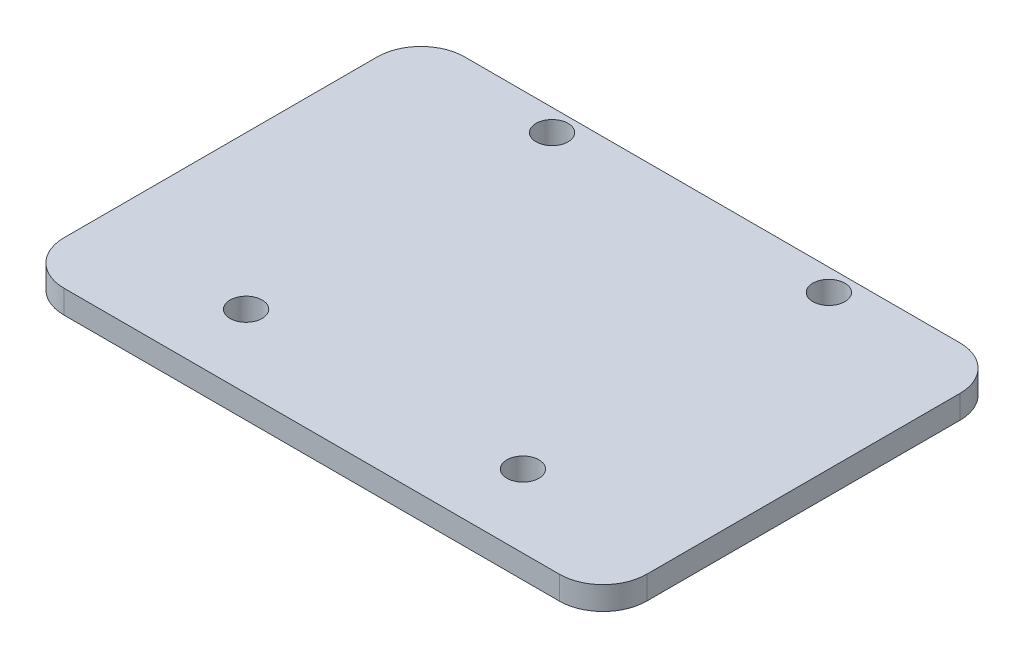
ISO-10303-21;
HEADER;
FILE_DESCRIPTION(('STEP AP214'),'2;1');
FILE_NAME('part.step','',(''),(''),'','','');
FILE_SCHEMA(('AUTOMOTIVE_DESIGN { 1 0 10303 214 1 1 1 1 }'));
ENDSEC;
DATA;
#1=APPLICATION_CONTEXT('core data for automotive mechanical design processes');
#2=APPLICATION_PROTOCOL_DEFINITION('international standard','automotive_design',2000,#1);
#3=PRODUCT_CONTEXT('',#1,'mechanical');
#4=PRODUCT('Part','Part','',(#3));
#5=PRODUCT_RELATED_PRODUCT_CATEGORY('part','',(#4));
#6=PRODUCT_DEFINITION_FORMATION('','',#4);
#7=PRODUCT_DEFINITION_CONTEXT('part definition',#1,'design');
#8=PRODUCT_DEFINITION('design','',#6,#7);
#9=PRODUCT_DEFINITION_SHAPE('','',#8);
#10=(LENGTH_UNIT() NAMED_UNIT(*) SI_UNIT(.MILLI.,.METRE.));
#11=(NAMED_UNIT(*) PLANE_ANGLE_UNIT() SI_UNIT($,.RADIAN.));
#12=(NAMED_UNIT(*) SI_UNIT($,.STERADIAN.) SOLID_ANGLE_UNIT());
#13=UNCERTAINTY_MEASURE_WITH_UNIT(LENGTH_MEASURE(1.E-05),#10,'distance_accuracy_value','');
#14=(GEOMETRIC_REPRESENTATION_CONTEXT(3) GLOBAL_UNCERTAINTY_ASSIGNED_CONTEXT((#13)) GLOBAL_UNIT_ASSIGNED_CONTEXT((#10,
#11,#12)) REPRESENTATION_CONTEXT('',''));
#15=CARTESIAN_POINT('',(0.,0.,0.));
#16=DIRECTION('',(0.,0.,1.));
#17=DIRECTION('',(1.,0.,0.));
#18=AXIS2_PLACEMENT_3D('',#15,#16,#17);
#19=CARTESIAN_POINT('',(-20.,1.6,-13.75));
#20=DIRECTION('',(1.,0.,0.));
#21=DIRECTION('',(0.,0.,-1.));
#22=AXIS2_PLACEMENT_3D('',#19,#20,#21);
#23=PLANE('',#22);
#24=DIRECTION('',(0.,0.,1.));
#25=VECTOR('',#24,1.);
#26=CARTESIAN_POINT('',(-20.,0.,-13.75));
#27=LINE('',#26,#25);
#28=CARTESIAN_POINT('',(-20.,0.,-10.75));
#29=VERTEX_POINT('',#28);
#30=CARTESIAN_POINT('',(-20.,0.,10.75));
#31=VERTEX_POINT('',#30);
#32=EDGE_CURVE('E166',#29,#31,#27,.T.);
#33=ORIENTED_EDGE('',*,*,#32,.T.);
#34=DIRECTION('',(0.,-1.,0.));
#35=VECTOR('',#34,1.);
#36=CARTESIAN_POINT('',(-20.,1.6,10.75));
#37=LINE('',#36,#35);
#38=CARTESIAN_POINT('',(-20.,1.6,10.75));
#39=VERTEX_POINT('',#38);
#40=EDGE_CURVE('E11',#31,#39,#37,.F.);
#41=ORIENTED_EDGE('',*,*,#40,.T.);
#42=DIRECTION('',(0.,0.,1.));
#43=VECTOR('',#42,1.);
#44=CARTESIAN_POINT('',(-20.,1.6,-13.75));
#45=LINE('',#44,#43);
#46=CARTESIAN_POINT('',(-20.,1.6,-10.75));
#47=VERTEX_POINT('',#46);
#48=EDGE_CURVE('E125',#47,#39,#45,.T.);
#49=ORIENTED_EDGE('',*,*,#48,.F.);
#50=DIRECTION('',(0.,-1.,0.));
#51=VECTOR('',#50,1.);
#52=CARTESIAN_POINT('',(-20.,1.6,-10.75));
#53=LINE('',#52,#51);
#54=EDGE_CURVE('E41',#47,#29,#53,.T.);
#55=ORIENTED_EDGE('',*,*,#54,.T.);
#56=EDGE_LOOP('',(#33,#41,#49,#55));
#57=FACE_BOUND('',#56,.T.);
#58=ADVANCED_FACE('F33',(#57),#23,.F.);
#59=CARTESIAN_POINT('',(-20.,1.6,13.75));
#60=DIRECTION('',(0.,0.,-1.));
#61=DIRECTION('',(-1.,0.,0.));
#62=AXIS2_PLACEMENT_3D('',#59,#60,#61);
#63=PLANE('',#62);
#64=DIRECTION('',(1.,0.,0.));
#65=VECTOR('',#64,1.);
#66=CARTESIAN_POINT('',(-20.,0.,13.75));
#67=LINE('',#66,#65);
#68=CARTESIAN_POINT('',(-17.,0.,13.75));
#69=VERTEX_POINT('',#68);
#70=CARTESIAN_POINT('',(17.,0.,13.75));
#71=VERTEX_POINT('',#70);
#72=EDGE_CURVE('E130',#69,#71,#67,.T.);
#73=ORIENTED_EDGE('',*,*,#72,.T.);
#74=DIRECTION('',(0.,-1.,0.));
#75=VECTOR('',#74,1.);
#76=CARTESIAN_POINT('',(17.,1.6,13.75));
#77=LINE('',#76,#75);
#78=CARTESIAN_POINT('',(17.,1.6,13.75));
#79=VERTEX_POINT('',#78);
#80=EDGE_CURVE('E48',#71,#79,#77,.F.);
#81=ORIENTED_EDGE('',*,*,#80,.T.);
#82=DIRECTION('',(1.,0.,0.));
#83=VECTOR('',#82,1.);
#84=CARTESIAN_POINT('',(-20.,1.6,13.75));
#85=LINE('',#84,#83);
#86=CARTESIAN_POINT('',(-17.,1.6,13.75));
#87=VERTEX_POINT('',#86);
#88=EDGE_CURVE('E128',#87,#79,#85,.T.);
#89=ORIENTED_EDGE('',*,*,#88,.F.);
#90=DIRECTION('',(0.,-1.,0.));
#91=VECTOR('',#90,1.);
#92=CARTESIAN_POINT('',(-17.,1.6,13.75));
#93=LINE('',#92,#91);
#94=EDGE_CURVE('E158',#87,#69,#93,.T.);
#95=ORIENTED_EDGE('',*,*,#94,.T.);
#96=EDGE_LOOP('',(#73,#81,#89,#95));
#97=FACE_BOUND('',#96,.T.);
#98=ADVANCED_FACE('F213',(#97),#63,.F.);
#99=CARTESIAN_POINT('',(20.,1.6,-13.75));
#100=DIRECTION('',(-1.,0.,0.));
#101=DIRECTION('',(0.,0.,1.));
#102=AXIS2_PLACEMENT_3D('',#99,#100,#101);
#103=PLANE('',#102);
#104=DIRECTION('',(0.,0.,-1.));
#105=VECTOR('',#104,1.);
#106=CARTESIAN_POINT('',(20.,0.,-13.75));
#107=LINE('',#106,#105);
#108=CARTESIAN_POINT('',(20.,0.,10.75));
#109=VERTEX_POINT('',#108);
#110=CARTESIAN_POINT('',(20.,0.,-10.75));
#111=VERTEX_POINT('',#110);
#112=EDGE_CURVE('E126',#109,#111,#107,.T.);
#113=ORIENTED_EDGE('',*,*,#112,.T.);
#114=DIRECTION('',(0.,-1.,0.));
#115=VECTOR('',#114,1.);
#116=CARTESIAN_POINT('',(20.,1.6,-10.75));
#117=LINE('',#116,#115);
#118=CARTESIAN_POINT('',(20.,1.6,-10.75));
#119=VERTEX_POINT('',#118);
#120=EDGE_CURVE('E104',#111,#119,#117,.F.);
#121=ORIENTED_EDGE('',*,*,#120,.T.);
#122=DIRECTION('',(0.,0.,-1.));
#123=VECTOR('',#122,1.);
#124=CARTESIAN_POINT('',(20.,1.6,-13.75));
#125=LINE('',#124,#123);
#126=CARTESIAN_POINT('',(20.,1.6,10.75));
#127=VERTEX_POINT('',#126);
#128=EDGE_CURVE('E177',#127,#119,#125,.T.);
#129=ORIENTED_EDGE('',*,*,#128,.F.);
#130=DIRECTION('',(0.,-1.,0.));
#131=VECTOR('',#130,1.);
#132=CARTESIAN_POINT('',(20.,1.6,10.75));
#133=LINE('',#132,#131);
#134=EDGE_CURVE('E109',#127,#109,#133,.T.);
#135=ORIENTED_EDGE('',*,*,#134,.T.);
#136=EDGE_LOOP('',(#113,#121,#129,#135));
#137=FACE_BOUND('',#136,.T.);
#138=ADVANCED_FACE('F210',(#137),#103,.F.);
#139=CARTESIAN_POINT('',(-20.,1.6,-13.75));
#140=DIRECTION('',(0.,0.,1.));
#141=DIRECTION('',(1.,0.,0.));
#142=AXIS2_PLACEMENT_3D('',#139,#140,#141);
#143=PLANE('',#142);
#144=DIRECTION('',(-1.,0.,0.));
#145=VECTOR('',#144,1.);
#146=CARTESIAN_POINT('',(-20.,1.6,-13.75));
#147=LINE('',#146,#145);
#148=CARTESIAN_POINT('',(17.,1.6,-13.75));
#149=VERTEX_POINT('',#148);
#150=CARTESIAN_POINT('',(-17.,1.6,-13.75));
#151=VERTEX_POINT('',#150);
#152=EDGE_CURVE('E119',#149,#151,#147,.T.);
#153=ORIENTED_EDGE('',*,*,#152,.F.);
#154=DIRECTION('',(0.,-1.,0.));
#155=VECTOR('',#154,1.);
#156=CARTESIAN_POINT('',(17.,1.6,-13.75));
#157=LINE('',#156,#155);
#158=CARTESIAN_POINT('',(17.,0.,-13.75));
#159=VERTEX_POINT('',#158);
#160=EDGE_CURVE('E103',#149,#159,#157,.T.);
#161=ORIENTED_EDGE('',*,*,#160,.T.);
#162=DIRECTION('',(-1.,0.,0.));
#163=VECTOR('',#162,1.);
#164=CARTESIAN_POINT('',(-20.,0.,-13.75));
#165=LINE('',#164,#163);
#166=CARTESIAN_POINT('',(-17.,0.,-13.75));
#167=VERTEX_POINT('',#166);
#168=EDGE_CURVE('E116',#159,#167,#165,.T.);
#169=ORIENTED_EDGE('',*,*,#168,.T.);
#170=DIRECTION('',(0.,-1.,0.));
#171=VECTOR('',#170,1.);
#172=CARTESIAN_POINT('',(-17.,1.6,-13.75));
#173=LINE('',#172,#171);
#174=EDGE_CURVE('E121',#167,#151,#173,.F.);
#175=ORIENTED_EDGE('',*,*,#174,.T.);
#176=EDGE_LOOP('',(#153,#161,#169,#175));
#177=FACE_BOUND('',#176,.T.);
#178=ADVANCED_FACE('F115',(#177),#143,.F.);
#179=CARTESIAN_POINT('',(0.,1.6,0.));
#180=DIRECTION('',(0.,1.,0.));
#181=DIRECTION('',(0.,0.,1.));
#182=AXIS2_PLACEMENT_3D('',#179,#180,#181);
#183=PLANE('',#182);
#184=CARTESIAN_POINT('',(-9.5,1.6,-12.25));
#185=DIRECTION('',(0.,1.,0.));
#186=DIRECTION('',(0.,0.,1.));
#187=AXIS2_PLACEMENT_3D('',#184,#185,#186);
#188=CIRCLE('',#187,1.1);
#189=CARTESIAN_POINT('',(-9.5,1.6,-11.15));
#190=VERTEX_POINT('',#189);
#191=EDGE_CURVE('E190',#190,#190,#188,.T.);
#192=ORIENTED_EDGE('',*,*,#191,.F.);
#193=EDGE_LOOP('',(#192));
#194=FACE_BOUND('',#193,.T.);
#195=CARTESIAN_POINT('',(9.5,1.6,-12.25));
#196=DIRECTION('',(0.,1.,0.));
#197=DIRECTION('',(0.,0.,1.));
#198=AXIS2_PLACEMENT_3D('',#195,#196,#197);
#199=CIRCLE('',#198,1.1);
#200=CARTESIAN_POINT('',(9.5,1.6,-11.15));
#201=VERTEX_POINT('',#200);
#202=EDGE_CURVE('E142',#201,#201,#199,.T.);
#203=ORIENTED_EDGE('',*,*,#202,.F.);
#204=EDGE_LOOP('',(#203));
#205=FACE_BOUND('',#204,.T.);
#206=CARTESIAN_POINT('',(9.5,1.6,8.75));
#207=DIRECTION('',(0.,1.,0.));
#208=DIRECTION('',(0.,0.,1.));
#209=AXIS2_PLACEMENT_3D('',#206,#207,#208);
#210=CIRCLE('',#209,1.1);
#211=CARTESIAN_POINT('',(9.5,1.6,9.85));
#212=VERTEX_POINT('',#211);
#213=EDGE_CURVE('E138',#212,#212,#210,.T.);
#214=ORIENTED_EDGE('',*,*,#213,.F.);
#215=EDGE_LOOP('',(#214));
#216=FACE_BOUND('',#215,.T.);
#217=CARTESIAN_POINT('',(-9.5,1.6,8.75));
#218=DIRECTION('',(0.,1.,0.));
#219=DIRECTION('',(0.,0.,1.));
#220=AXIS2_PLACEMENT_3D('',#217,#218,#219);
#221=CIRCLE('',#220,1.1);
#222=CARTESIAN_POINT('',(-9.5,1.6,9.85));
#223=VERTEX_POINT('',#222);
#224=EDGE_CURVE('E137',#223,#223,#221,.T.);
#225=ORIENTED_EDGE('',*,*,#224,.F.);
#226=EDGE_LOOP('',(#225));
#227=FACE_BOUND('',#226,.T.);
#228=ORIENTED_EDGE('',*,*,#128,.T.);
#229=CARTESIAN_POINT('',(17.,1.6,-10.75));
#230=DIRECTION('',(0.,1.,0.));
#231=DIRECTION('',(0.,0.,1.));
#232=AXIS2_PLACEMENT_3D('',#229,#230,#231);
#233=CIRCLE('',#232,3.);
#234=EDGE_CURVE('E156',#119,#149,#233,.T.);
#235=ORIENTED_EDGE('',*,*,#234,.T.);
#236=ORIENTED_EDGE('',*,*,#152,.T.);
#237=CARTESIAN_POINT('',(-17.,1.6,-10.75));
#238=DIRECTION('',(0.,1.,0.));
#239=DIRECTION('',(0.,0.,1.));
#240=AXIS2_PLACEMENT_3D('',#237,#238,#239);
#241=CIRCLE('',#240,3.);
#242=EDGE_CURVE('E151',#151,#47,#241,.T.);
#243=ORIENTED_EDGE('',*,*,#242,.T.);
#244=ORIENTED_EDGE('',*,*,#48,.T.);
#245=CARTESIAN_POINT('',(-17.,1.6,10.75));
#246=DIRECTION('',(0.,1.,0.));
#247=DIRECTION('',(0.,0.,1.));
#248=AXIS2_PLACEMENT_3D('',#245,#246,#247);
#249=CIRCLE('',#248,3.);
#250=EDGE_CURVE('E55',#39,#87,#249,.T.);
#251=ORIENTED_EDGE('',*,*,#250,.T.);
#252=ORIENTED_EDGE('',*,*,#88,.T.);
#253=CARTESIAN_POINT('',(17.,1.6,10.75));
#254=DIRECTION('',(0.,1.,0.));
#255=DIRECTION('',(0.,0.,1.));
#256=AXIS2_PLACEMENT_3D('',#253,#254,#255);
#257=CIRCLE('',#256,3.);
#258=EDGE_CURVE('E154',#79,#127,#257,.T.);
#259=ORIENTED_EDGE('',*,*,#258,.T.);
#260=EDGE_LOOP('',(#228,#235,#236,#243,#244,#251,#252,#259));
#261=FACE_BOUND('',#260,.T.);
#262=ADVANCED_FACE('F197',(#194,#205,#216,#227,#261),#183,.T.);
#263=CARTESIAN_POINT('',(0.,0.,0.));
#264=DIRECTION('',(0.,1.,0.));
#265=DIRECTION('',(0.,0.,1.));
#266=AXIS2_PLACEMENT_3D('',#263,#264,#265);
#267=PLANE('',#266);
#268=CARTESIAN_POINT('',(-9.5,0.,-12.25));
#269=DIRECTION('',(0.,1.,0.));
#270=DIRECTION('',(0.,0.,1.));
#271=AXIS2_PLACEMENT_3D('',#268,#269,#270);
#272=CIRCLE('',#271,1.1);
#273=CARTESIAN_POINT('',(-9.5,0.,-11.15));
#274=VERTEX_POINT('',#273);
#275=EDGE_CURVE('E187',#274,#274,#272,.T.);
#276=ORIENTED_EDGE('',*,*,#275,.T.);
#277=EDGE_LOOP('',(#276));
#278=FACE_BOUND('',#277,.T.);
#279=CARTESIAN_POINT('',(9.5,0.,-12.25));
#280=DIRECTION('',(0.,1.,0.));
#281=DIRECTION('',(0.,0.,1.));
#282=AXIS2_PLACEMENT_3D('',#279,#280,#281);
#283=CIRCLE('',#282,1.1);
#284=CARTESIAN_POINT('',(9.5,0.,-11.15));
#285=VERTEX_POINT('',#284);
#286=EDGE_CURVE('E139',#285,#285,#283,.T.);
#287=ORIENTED_EDGE('',*,*,#286,.T.);
#288=EDGE_LOOP('',(#287));
#289=FACE_BOUND('',#288,.T.);
#290=CARTESIAN_POINT('',(9.5,0.,8.75));
#291=DIRECTION('',(0.,1.,0.));
#292=DIRECTION('',(0.,0.,1.));
#293=AXIS2_PLACEMENT_3D('',#290,#291,#292);
#294=CIRCLE('',#293,1.1);
#295=CARTESIAN_POINT('',(9.5,0.,9.85));
#296=VERTEX_POINT('',#295);
#297=EDGE_CURVE('E134',#296,#296,#294,.T.);
#298=ORIENTED_EDGE('',*,*,#297,.T.);
#299=EDGE_LOOP('',(#298));
#300=FACE_BOUND('',#299,.T.);
#301=CARTESIAN_POINT('',(-9.5,0.,8.75));
#302=DIRECTION('',(0.,1.,0.));
#303=DIRECTION('',(0.,0.,1.));
#304=AXIS2_PLACEMENT_3D('',#301,#302,#303);
#305=CIRCLE('',#304,1.1);
#306=CARTESIAN_POINT('',(-9.5,0.,9.85));
#307=VERTEX_POINT('',#306);
#308=EDGE_CURVE('E171',#307,#307,#305,.T.);
#309=ORIENTED_EDGE('',*,*,#308,.T.);
#310=EDGE_LOOP('',(#309));
#311=FACE_BOUND('',#310,.T.);
#312=ORIENTED_EDGE('',*,*,#168,.F.);
#313=CARTESIAN_POINT('',(17.,0.,-10.75));
#314=DIRECTION('',(0.,1.,0.));
#315=DIRECTION('',(0.,0.,1.));
#316=AXIS2_PLACEMENT_3D('',#313,#314,#315);
#317=CIRCLE('',#316,3.);
#318=EDGE_CURVE('E99',#159,#111,#317,.F.);
#319=ORIENTED_EDGE('',*,*,#318,.T.);
#320=ORIENTED_EDGE('',*,*,#112,.F.);
#321=CARTESIAN_POINT('',(17.,0.,10.75));
#322=DIRECTION('',(0.,1.,0.));
#323=DIRECTION('',(0.,0.,1.));
#324=AXIS2_PLACEMENT_3D('',#321,#322,#323);
#325=CIRCLE('',#324,3.);
#326=EDGE_CURVE('E110',#109,#71,#325,.F.);
#327=ORIENTED_EDGE('',*,*,#326,.T.);
#328=ORIENTED_EDGE('',*,*,#72,.F.);
#329=CARTESIAN_POINT('',(-17.,0.,10.75));
#330=DIRECTION('',(0.,1.,0.));
#331=DIRECTION('',(0.,0.,1.));
#332=AXIS2_PLACEMENT_3D('',#329,#330,#331);
#333=CIRCLE('',#332,3.);
#334=EDGE_CURVE('E145',#69,#31,#333,.F.);
#335=ORIENTED_EDGE('',*,*,#334,.T.);
#336=ORIENTED_EDGE('',*,*,#32,.F.);
#337=CARTESIAN_POINT('',(-17.,0.,-10.75));
#338=DIRECTION('',(0.,1.,0.));
#339=DIRECTION('',(0.,0.,1.));
#340=AXIS2_PLACEMENT_3D('',#337,#338,#339);
#341=CIRCLE('',#340,3.);
#342=EDGE_CURVE('E120',#29,#167,#341,.F.);
#343=ORIENTED_EDGE('',*,*,#342,.T.);
#344=EDGE_LOOP('',(#312,#319,#320,#327,#328,#335,#336,#343));
#345=FACE_BOUND('',#344,.T.);
#346=ADVANCED_FACE('F123',(#278,#289,#300,#311,#345),#267,.F.);
#347=CARTESIAN_POINT('',(-9.5,1.6,8.75));
#348=DIRECTION('',(0.,1.,0.));
#349=DIRECTION('',(0.,0.,1.));
#350=AXIS2_PLACEMENT_3D('',#347,#348,#349);
#351=CYLINDRICAL_SURFACE('',#350,1.1);
#352=ORIENTED_EDGE('',*,*,#224,.T.);
#353=EDGE_LOOP('',(#352));
#354=FACE_BOUND('',#353,.T.);
#355=ORIENTED_EDGE('',*,*,#308,.F.);
#356=EDGE_LOOP('',(#355));
#357=FACE_BOUND('',#356,.T.);
#358=ADVANCED_FACE('F278',(#354,#357),#351,.F.);
#359=CARTESIAN_POINT('',(9.5,1.6,8.75));
#360=DIRECTION('',(0.,1.,0.));
#361=DIRECTION('',(0.,0.,1.));
#362=AXIS2_PLACEMENT_3D('',#359,#360,#361);
#363=CYLINDRICAL_SURFACE('',#362,1.1);
#364=ORIENTED_EDGE('',*,*,#213,.T.);
#365=EDGE_LOOP('',(#364));
#366=FACE_BOUND('',#365,.T.);
#367=ORIENTED_EDGE('',*,*,#297,.F.);
#368=EDGE_LOOP('',(#367));
#369=FACE_BOUND('',#368,.T.);
#370=ADVANCED_FACE('F269',(#366,#369),#363,.F.);
#371=CARTESIAN_POINT('',(9.5,1.6,-12.25));
#372=DIRECTION('',(0.,1.,0.));
#373=DIRECTION('',(0.,0.,1.));
#374=AXIS2_PLACEMENT_3D('',#371,#372,#373);
#375=CYLINDRICAL_SURFACE('',#374,1.1);
#376=ORIENTED_EDGE('',*,*,#202,.T.);
#377=EDGE_LOOP('',(#376));
#378=FACE_BOUND('',#377,.T.);
#379=ORIENTED_EDGE('',*,*,#286,.F.);
#380=EDGE_LOOP('',(#379));
#381=FACE_BOUND('',#380,.T.);
#382=ADVANCED_FACE('F261',(#378,#381),#375,.F.);
#383=CARTESIAN_POINT('',(-9.5,1.6,-12.25));
#384=DIRECTION('',(0.,1.,0.));
#385=DIRECTION('',(0.,0.,1.));
#386=AXIS2_PLACEMENT_3D('',#383,#384,#385);
#387=CYLINDRICAL_SURFACE('',#386,1.1);
#388=ORIENTED_EDGE('',*,*,#191,.T.);
#389=EDGE_LOOP('',(#388));
#390=FACE_BOUND('',#389,.T.);
#391=ORIENTED_EDGE('',*,*,#275,.F.);
#392=EDGE_LOOP('',(#391));
#393=FACE_BOUND('',#392,.T.);
#394=ADVANCED_FACE('F194',(#390,#393),#387,.F.);
#395=CARTESIAN_POINT('',(17.,1.6,-10.75));
#396=DIRECTION('',(0.,-1.,0.));
#397=DIRECTION('',(0.,0.,-1.));
#398=AXIS2_PLACEMENT_3D('',#395,#396,#397);
#399=CYLINDRICAL_SURFACE('',#398,3.);
#400=ORIENTED_EDGE('',*,*,#234,.F.);
#401=ORIENTED_EDGE('',*,*,#120,.F.);
#402=ORIENTED_EDGE('',*,*,#318,.F.);
#403=ORIENTED_EDGE('',*,*,#160,.F.);
#404=EDGE_LOOP('',(#400,#401,#402,#403));
#405=FACE_BOUND('',#404,.T.);
#406=ADVANCED_FACE('F102',(#405),#399,.T.);
#407=CARTESIAN_POINT('',(17.,1.6,10.75));
#408=DIRECTION('',(0.,-1.,0.));
#409=DIRECTION('',(0.,0.,-1.));
#410=AXIS2_PLACEMENT_3D('',#407,#408,#409);
#411=CYLINDRICAL_SURFACE('',#410,3.);
#412=ORIENTED_EDGE('',*,*,#258,.F.);
#413=ORIENTED_EDGE('',*,*,#80,.F.);
#414=ORIENTED_EDGE('',*,*,#326,.F.);
#415=ORIENTED_EDGE('',*,*,#134,.F.);
#416=EDGE_LOOP('',(#412,#413,#414,#415));
#417=FACE_BOUND('',#416,.T.);
#418=ADVANCED_FACE('F212',(#417),#411,.T.);
#419=CARTESIAN_POINT('',(-17.,1.6,10.75));
#420=DIRECTION('',(0.,-1.,0.));
#421=DIRECTION('',(0.,0.,-1.));
#422=AXIS2_PLACEMENT_3D('',#419,#420,#421);
#423=CYLINDRICAL_SURFACE('',#422,3.);
#424=ORIENTED_EDGE('',*,*,#250,.F.);
#425=ORIENTED_EDGE('',*,*,#40,.F.);
#426=ORIENTED_EDGE('',*,*,#334,.F.);
#427=ORIENTED_EDGE('',*,*,#94,.F.);
#428=EDGE_LOOP('',(#424,#425,#426,#427));
#429=FACE_BOUND('',#428,.T.);
#430=ADVANCED_FACE('F216',(#429),#423,.T.);
#431=CARTESIAN_POINT('',(-17.,1.6,-10.75));
#432=DIRECTION('',(0.,-1.,0.));
#433=DIRECTION('',(0.,0.,-1.));
#434=AXIS2_PLACEMENT_3D('',#431,#432,#433);
#435=CYLINDRICAL_SURFACE('',#434,3.);
#436=ORIENTED_EDGE('',*,*,#242,.F.);
#437=ORIENTED_EDGE('',*,*,#174,.F.);
#438=ORIENTED_EDGE('',*,*,#342,.F.);
#439=ORIENTED_EDGE('',*,*,#54,.F.);
#440=EDGE_LOOP('',(#436,#437,#438,#439));
#441=FACE_BOUND('',#440,.T.);
#442=ADVANCED_FACE('F35',(#441),#435,.T.);
#443=CLOSED_SHELL('',(#58,#98,#138,#178,#262,#346,#358,#370,#382,#394,#406,#418,#430,#442));
#444=MANIFOLD_SOLID_BREP('B2',#443);
#445=ADVANCED_BREP_SHAPE_REPRESENTATION('',(#18,#444),#14);
#446=SHAPE_DEFINITION_REPRESENTATION(#9,#445);
ENDSEC;
END-ISO-10303-21;
